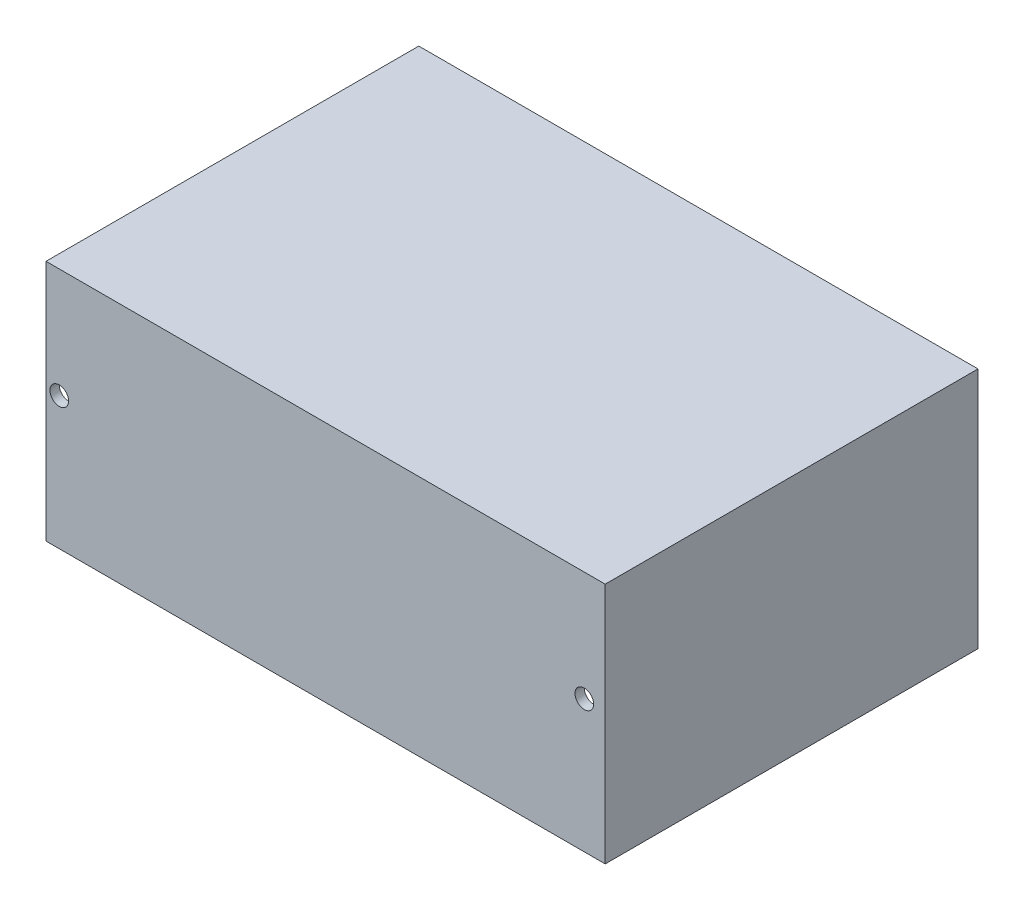
ISO-10303-21;
HEADER;
FILE_DESCRIPTION(('STEP AP214'),'2;1');
FILE_NAME('part.step','',(''),(''),'','','');
FILE_SCHEMA(('AUTOMOTIVE_DESIGN { 1 0 10303 214 1 1 1 1 }'));
ENDSEC;
DATA;
#1=APPLICATION_CONTEXT('core data for automotive mechanical design processes');
#2=APPLICATION_PROTOCOL_DEFINITION('international standard','automotive_design',2000,#1);
#3=PRODUCT_CONTEXT('',#1,'mechanical');
#4=PRODUCT('Part','Part','',(#3));
#5=PRODUCT_RELATED_PRODUCT_CATEGORY('part','',(#4));
#6=PRODUCT_DEFINITION_FORMATION('','',#4);
#7=PRODUCT_DEFINITION_CONTEXT('part definition',#1,'design');
#8=PRODUCT_DEFINITION('design','',#6,#7);
#9=PRODUCT_DEFINITION_SHAPE('','',#8);
#10=(LENGTH_UNIT() NAMED_UNIT(*) SI_UNIT(.MILLI.,.METRE.));
#11=(NAMED_UNIT(*) PLANE_ANGLE_UNIT() SI_UNIT($,.RADIAN.));
#12=(NAMED_UNIT(*) SI_UNIT($,.STERADIAN.) SOLID_ANGLE_UNIT());
#13=UNCERTAINTY_MEASURE_WITH_UNIT(LENGTH_MEASURE(1.E-05),#10,'distance_accuracy_value','');
#14=(GEOMETRIC_REPRESENTATION_CONTEXT(3) GLOBAL_UNCERTAINTY_ASSIGNED_CONTEXT((#13)) GLOBAL_UNIT_ASSIGNED_CONTEXT((#10,
#11,#12)) REPRESENTATION_CONTEXT('',''));
#15=CARTESIAN_POINT('',(0.,0.,0.));
#16=DIRECTION('',(0.,0.,1.));
#17=DIRECTION('',(1.,0.,0.));
#18=AXIS2_PLACEMENT_3D('',#15,#16,#17);
#19=CARTESIAN_POINT('',(300.,123.885017421603,181.15614040887));
#20=DIRECTION('',(0.,0.,-1.));
#21=DIRECTION('',(-1.,0.,0.));
#22=AXIS2_PLACEMENT_3D('',#19,#20,#21);
#23=PLANE('',#22);
#24=CARTESIAN_POINT('',(7.10538066,65.,181.15614040887));
#25=DIRECTION('',(0.,0.,1.));
#26=DIRECTION('',(1.,0.,0.));
#27=AXIS2_PLACEMENT_3D('',#24,#25,#26);
#28=CIRCLE('',#27,5.);
#29=CARTESIAN_POINT('',(12.10538066,65.,181.15614040887));
#30=VERTEX_POINT('',#29);
#31=EDGE_CURVE('E193',#30,#30,#28,.T.);
#32=ORIENTED_EDGE('',*,*,#31,.F.);
#33=EDGE_LOOP('',(#32));
#34=FACE_BOUND('',#33,.T.);
#35=CARTESIAN_POINT('',(288.794979596571,65.,181.15614040887));
#36=DIRECTION('',(0.,0.,-1.));
#37=DIRECTION('',(-1.,0.,0.));
#38=AXIS2_PLACEMENT_3D('',#35,#36,#37);
#39=CIRCLE('',#38,4.99999999999999);
#40=CARTESIAN_POINT('',(283.794979596571,65.,181.15614040887));
#41=VERTEX_POINT('',#40);
#42=EDGE_CURVE('E145',#41,#41,#39,.T.);
#43=ORIENTED_EDGE('',*,*,#42,.T.);
#44=EDGE_LOOP('',(#43));
#45=FACE_BOUND('',#44,.T.);
#46=DIRECTION('',(0.,-1.,0.));
#47=VECTOR('',#46,1.);
#48=CARTESIAN_POINT('',(0.,123.885017421603,181.15614040887));
#49=LINE('',#48,#47);
#50=CARTESIAN_POINT('',(0.,123.885017421603,181.15614040887));
#51=VERTEX_POINT('',#50);
#52=CARTESIAN_POINT('',(0.,-6.11498257839724,181.15614040887));
#53=VERTEX_POINT('',#52);
#54=EDGE_CURVE('E155',#51,#53,#49,.T.);
#55=ORIENTED_EDGE('',*,*,#54,.T.);
#56=DIRECTION('',(-1.,0.,0.));
#57=VECTOR('',#56,1.);
#58=CARTESIAN_POINT('',(300.,-6.11498257839724,181.15614040887));
#59=LINE('',#58,#57);
#60=CARTESIAN_POINT('',(300.,-6.11498257839724,181.15614040887));
#61=VERTEX_POINT('',#60);
#62=EDGE_CURVE('E11',#61,#53,#59,.T.);
#63=ORIENTED_EDGE('',*,*,#62,.F.);
#64=DIRECTION('',(0.,-1.,0.));
#65=VECTOR('',#64,1.);
#66=CARTESIAN_POINT('',(300.,123.885017421603,181.15614040887));
#67=LINE('',#66,#65);
#68=CARTESIAN_POINT('',(300.,123.885017421603,181.15614040887));
#69=VERTEX_POINT('',#68);
#70=EDGE_CURVE('E156',#69,#61,#67,.T.);
#71=ORIENTED_EDGE('',*,*,#70,.F.);
#72=DIRECTION('',(-1.,0.,0.));
#73=VECTOR('',#72,1.);
#74=CARTESIAN_POINT('',(300.,123.885017421603,181.15614040887));
#75=LINE('',#74,#73);
#76=EDGE_CURVE('E162',#69,#51,#75,.T.);
#77=ORIENTED_EDGE('',*,*,#76,.T.);
#78=EDGE_LOOP('',(#55,#63,#71,#77));
#79=FACE_BOUND('',#78,.T.);
#80=ADVANCED_FACE('F41',(#34,#45,#79),#23,.F.);
#81=CARTESIAN_POINT('',(300.,-6.11498257839724,181.15614040887));
#82=DIRECTION('',(0.,1.,0.));
#83=DIRECTION('',(0.,0.,1.));
#84=AXIS2_PLACEMENT_3D('',#81,#82,#83);
#85=PLANE('',#84);
#86=DIRECTION('',(0.,0.,-1.));
#87=VECTOR('',#86,1.);
#88=CARTESIAN_POINT('',(295.,-6.11498257839724,181.15614040887));
#89=LINE('',#88,#87);
#90=CARTESIAN_POINT('',(295.,-6.11498257839724,176.15614040887));
#91=VERTEX_POINT('',#90);
#92=CARTESIAN_POINT('',(295.,-6.11498257839724,-13.8438595911297));
#93=VERTEX_POINT('',#92);
#94=EDGE_CURVE('E136',#91,#93,#89,.T.);
#95=ORIENTED_EDGE('',*,*,#94,.T.);
#96=DIRECTION('',(-1.,0.,0.));
#97=VECTOR('',#96,1.);
#98=CARTESIAN_POINT('',(300.,-6.11498257839724,-13.8438595911297));
#99=LINE('',#98,#97);
#100=CARTESIAN_POINT('',(0.,-6.11498257839724,-13.8438595911297));
#101=VERTEX_POINT('',#100);
#102=EDGE_CURVE('E146',#93,#101,#99,.T.);
#103=ORIENTED_EDGE('',*,*,#102,.T.);
#104=DIRECTION('',(0.,0.,-1.));
#105=VECTOR('',#104,1.);
#106=CARTESIAN_POINT('',(0.,-6.11498257839724,181.15614040887));
#107=LINE('',#106,#105);
#108=CARTESIAN_POINT('',(0.,-6.11498257839724,-18.8438595911297));
#109=VERTEX_POINT('',#108);
#110=EDGE_CURVE('E164',#101,#109,#107,.T.);
#111=ORIENTED_EDGE('',*,*,#110,.T.);
#112=DIRECTION('',(-1.,0.,0.));
#113=VECTOR('',#112,1.);
#114=CARTESIAN_POINT('',(300.,-6.11498257839724,-18.8438595911297));
#115=LINE('',#114,#113);
#116=CARTESIAN_POINT('',(300.,-6.11498257839724,-18.8438595911297));
#117=VERTEX_POINT('',#116);
#118=EDGE_CURVE('E47',#117,#109,#115,.T.);
#119=ORIENTED_EDGE('',*,*,#118,.F.);
#120=DIRECTION('',(0.,0.,-1.));
#121=VECTOR('',#120,1.);
#122=CARTESIAN_POINT('',(300.,-6.11498257839724,181.15614040887));
#123=LINE('',#122,#121);
#124=EDGE_CURVE('E92',#61,#117,#123,.T.);
#125=ORIENTED_EDGE('',*,*,#124,.F.);
#126=ORIENTED_EDGE('',*,*,#62,.T.);
#127=CARTESIAN_POINT('',(0.,-6.11498257839724,176.15614040887));
#128=VERTEX_POINT('',#127);
#129=EDGE_CURVE('E168',#53,#128,#107,.T.);
#130=ORIENTED_EDGE('',*,*,#129,.T.);
#131=DIRECTION('',(-1.,0.,0.));
#132=VECTOR('',#131,1.);
#133=CARTESIAN_POINT('',(300.,-6.11498257839724,176.15614040887));
#134=LINE('',#133,#132);
#135=EDGE_CURVE('E152',#91,#128,#134,.T.);
#136=ORIENTED_EDGE('',*,*,#135,.F.);
#137=EDGE_LOOP('',(#95,#103,#111,#119,#125,#126,#130,#136));
#138=FACE_BOUND('',#137,.T.);
#139=ADVANCED_FACE('F211',(#138),#85,.F.);
#140=CARTESIAN_POINT('',(300.,123.885017421603,-18.8438595911297));
#141=DIRECTION('',(0.,0.,1.));
#142=DIRECTION('',(0.,-1.,0.));
#143=AXIS2_PLACEMENT_3D('',#140,#141,#142);
#144=PLANE('',#143);
#145=CARTESIAN_POINT('',(7.10538066,65.,-18.8438595911297));
#146=DIRECTION('',(0.,0.,1.));
#147=DIRECTION('',(0.,-1.,0.));
#148=AXIS2_PLACEMENT_3D('',#145,#146,#147);
#149=CIRCLE('',#148,5.);
#150=CARTESIAN_POINT('',(7.10538066,60.,-18.8438595911297));
#151=VERTEX_POINT('',#150);
#152=EDGE_CURVE('E183',#151,#151,#149,.T.);
#153=ORIENTED_EDGE('',*,*,#152,.T.);
#154=EDGE_LOOP('',(#153));
#155=FACE_BOUND('',#154,.T.);
#156=CARTESIAN_POINT('',(288.794979596571,65.,-18.8438595911297));
#157=DIRECTION('',(0.,0.,-1.));
#158=DIRECTION('',(-1.,0.,0.));
#159=AXIS2_PLACEMENT_3D('',#156,#157,#158);
#160=CIRCLE('',#159,4.99999999999999);
#161=CARTESIAN_POINT('',(283.794979596571,65.,-18.8438595911297));
#162=VERTEX_POINT('',#161);
#163=EDGE_CURVE('E177',#162,#162,#160,.T.);
#164=ORIENTED_EDGE('',*,*,#163,.F.);
#165=EDGE_LOOP('',(#164));
#166=FACE_BOUND('',#165,.T.);
#167=DIRECTION('',(0.,1.,0.));
#168=VECTOR('',#167,1.);
#169=CARTESIAN_POINT('',(0.,123.885017421603,-18.8438595911297));
#170=LINE('',#169,#168);
#171=CARTESIAN_POINT('',(0.,123.885017421603,-18.8438595911297));
#172=VERTEX_POINT('',#171);
#173=EDGE_CURVE('E169',#109,#172,#170,.T.);
#174=ORIENTED_EDGE('',*,*,#173,.T.);
#175=DIRECTION('',(-1.,0.,0.));
#176=VECTOR('',#175,1.);
#177=CARTESIAN_POINT('',(300.,123.885017421603,-18.8438595911297));
#178=LINE('',#177,#176);
#179=CARTESIAN_POINT('',(300.,123.885017421603,-18.8438595911297));
#180=VERTEX_POINT('',#179);
#181=EDGE_CURVE('E173',#180,#172,#178,.T.);
#182=ORIENTED_EDGE('',*,*,#181,.F.);
#183=DIRECTION('',(0.,1.,0.));
#184=VECTOR('',#183,1.);
#185=CARTESIAN_POINT('',(300.,123.885017421603,-18.8438595911297));
#186=LINE('',#185,#184);
#187=EDGE_CURVE('E157',#117,#180,#186,.T.);
#188=ORIENTED_EDGE('',*,*,#187,.F.);
#189=ORIENTED_EDGE('',*,*,#118,.T.);
#190=EDGE_LOOP('',(#174,#182,#188,#189));
#191=FACE_BOUND('',#190,.T.);
#192=ADVANCED_FACE('F217',(#155,#166,#191),#144,.F.);
#193=CARTESIAN_POINT('',(300.,123.885017421603,181.15614040887));
#194=DIRECTION('',(0.,-1.,0.));
#195=DIRECTION('',(0.,0.,-1.));
#196=AXIS2_PLACEMENT_3D('',#193,#194,#195);
#197=PLANE('',#196);
#198=DIRECTION('',(0.,0.,1.));
#199=VECTOR('',#198,1.);
#200=CARTESIAN_POINT('',(0.,123.885017421603,181.15614040887));
#201=LINE('',#200,#199);
#202=EDGE_CURVE('E87',#172,#51,#201,.T.);
#203=ORIENTED_EDGE('',*,*,#202,.T.);
#204=ORIENTED_EDGE('',*,*,#76,.F.);
#205=DIRECTION('',(0.,0.,1.));
#206=VECTOR('',#205,1.);
#207=CARTESIAN_POINT('',(300.,123.885017421603,181.15614040887));
#208=LINE('',#207,#206);
#209=EDGE_CURVE('E66',#180,#69,#208,.T.);
#210=ORIENTED_EDGE('',*,*,#209,.F.);
#211=ORIENTED_EDGE('',*,*,#181,.T.);
#212=EDGE_LOOP('',(#203,#204,#210,#211));
#213=FACE_BOUND('',#212,.T.);
#214=ADVANCED_FACE('F218',(#213),#197,.F.);
#215=CARTESIAN_POINT('',(300.,0.,0.));
#216=DIRECTION('',(1.,0.,0.));
#217=DIRECTION('',(0.,0.,-1.));
#218=AXIS2_PLACEMENT_3D('',#215,#216,#217);
#219=PLANE('',#218);
#220=ORIENTED_EDGE('',*,*,#70,.T.);
#221=ORIENTED_EDGE('',*,*,#124,.T.);
#222=ORIENTED_EDGE('',*,*,#187,.T.);
#223=ORIENTED_EDGE('',*,*,#209,.T.);
#224=EDGE_LOOP('',(#220,#221,#222,#223));
#225=FACE_BOUND('',#224,.T.);
#226=ADVANCED_FACE('F223',(#225),#219,.T.);
#227=CARTESIAN_POINT('',(0.,0.,0.));
#228=DIRECTION('',(1.,0.,0.));
#229=DIRECTION('',(0.,0.,-1.));
#230=AXIS2_PLACEMENT_3D('',#227,#228,#229);
#231=PLANE('',#230);
#232=DIRECTION('',(0.,0.,1.));
#233=VECTOR('',#232,1.);
#234=CARTESIAN_POINT('',(0.,118.885017421603,181.15614040887));
#235=LINE('',#234,#233);
#236=CARTESIAN_POINT('',(0.,118.885017421603,-13.8438595911297));
#237=VERTEX_POINT('',#236);
#238=CARTESIAN_POINT('',(0.,118.885017421603,176.15614040887));
#239=VERTEX_POINT('',#238);
#240=EDGE_CURVE('E60',#237,#239,#235,.T.);
#241=ORIENTED_EDGE('',*,*,#240,.T.);
#242=DIRECTION('',(0.,-1.,0.));
#243=VECTOR('',#242,1.);
#244=CARTESIAN_POINT('',(0.,123.885017421603,176.15614040887));
#245=LINE('',#244,#243);
#246=EDGE_CURVE('E132',#239,#128,#245,.T.);
#247=ORIENTED_EDGE('',*,*,#246,.T.);
#248=ORIENTED_EDGE('',*,*,#129,.F.);
#249=ORIENTED_EDGE('',*,*,#54,.F.);
#250=ORIENTED_EDGE('',*,*,#202,.F.);
#251=ORIENTED_EDGE('',*,*,#173,.F.);
#252=ORIENTED_EDGE('',*,*,#110,.F.);
#253=DIRECTION('',(0.,1.,0.));
#254=VECTOR('',#253,1.);
#255=CARTESIAN_POINT('',(0.,123.885017421603,-13.8438595911297));
#256=LINE('',#255,#254);
#257=EDGE_CURVE('E137',#101,#237,#256,.T.);
#258=ORIENTED_EDGE('',*,*,#257,.T.);
#259=EDGE_LOOP('',(#241,#247,#248,#249,#250,#251,#252,#258));
#260=FACE_BOUND('',#259,.T.);
#261=ADVANCED_FACE('F212',(#260),#231,.F.);
#262=CARTESIAN_POINT('',(300.,123.885017421603,176.15614040887));
#263=DIRECTION('',(0.,0.,-1.));
#264=DIRECTION('',(-1.,0.,0.));
#265=AXIS2_PLACEMENT_3D('',#262,#263,#264);
#266=PLANE('',#265);
#267=CARTESIAN_POINT('',(7.10538066,65.,176.15614040887));
#268=DIRECTION('',(0.,0.,-1.));
#269=DIRECTION('',(-1.,0.,0.));
#270=AXIS2_PLACEMENT_3D('',#267,#268,#269);
#271=CIRCLE('',#270,5.);
#272=CARTESIAN_POINT('',(2.10538066,65.,176.15614040887));
#273=VERTEX_POINT('',#272);
#274=EDGE_CURVE('E186',#273,#273,#271,.T.);
#275=ORIENTED_EDGE('',*,*,#274,.F.);
#276=EDGE_LOOP('',(#275));
#277=FACE_BOUND('',#276,.T.);
#278=CARTESIAN_POINT('',(288.794979596571,65.,176.15614040887));
#279=DIRECTION('',(0.,0.,-1.));
#280=DIRECTION('',(-1.,0.,0.));
#281=AXIS2_PLACEMENT_3D('',#278,#279,#280);
#282=CIRCLE('',#281,4.99999999999999);
#283=CARTESIAN_POINT('',(283.794979596571,65.,176.15614040887));
#284=VERTEX_POINT('',#283);
#285=EDGE_CURVE('E178',#284,#284,#282,.T.);
#286=ORIENTED_EDGE('',*,*,#285,.F.);
#287=EDGE_LOOP('',(#286));
#288=FACE_BOUND('',#287,.T.);
#289=ORIENTED_EDGE('',*,*,#246,.F.);
#290=DIRECTION('',(-1.,0.,0.));
#291=VECTOR('',#290,1.);
#292=CARTESIAN_POINT('',(300.,118.885017421603,176.15614040887));
#293=LINE('',#292,#291);
#294=CARTESIAN_POINT('',(295.,118.885017421603,176.15614040887));
#295=VERTEX_POINT('',#294);
#296=EDGE_CURVE('E117',#295,#239,#293,.T.);
#297=ORIENTED_EDGE('',*,*,#296,.F.);
#298=DIRECTION('',(0.,-1.,0.));
#299=VECTOR('',#298,1.);
#300=CARTESIAN_POINT('',(295.,123.885017421603,176.15614040887));
#301=LINE('',#300,#299);
#302=EDGE_CURVE('E128',#295,#91,#301,.T.);
#303=ORIENTED_EDGE('',*,*,#302,.T.);
#304=ORIENTED_EDGE('',*,*,#135,.T.);
#305=EDGE_LOOP('',(#289,#297,#303,#304));
#306=FACE_BOUND('',#305,.T.);
#307=ADVANCED_FACE('F127',(#277,#288,#306),#266,.T.);
#308=CARTESIAN_POINT('',(300.,123.885017421603,-13.8438595911297));
#309=DIRECTION('',(0.,0.,1.));
#310=DIRECTION('',(0.,-1.,0.));
#311=AXIS2_PLACEMENT_3D('',#308,#309,#310);
#312=PLANE('',#311);
#313=CARTESIAN_POINT('',(7.10538066,65.,-13.8438595911297));
#314=DIRECTION('',(0.,0.,1.));
#315=DIRECTION('',(0.,-1.,0.));
#316=AXIS2_PLACEMENT_3D('',#313,#314,#315);
#317=CIRCLE('',#316,5.);
#318=CARTESIAN_POINT('',(7.10538066,60.,-13.8438595911297));
#319=VERTEX_POINT('',#318);
#320=EDGE_CURVE('E42',#319,#319,#317,.T.);
#321=ORIENTED_EDGE('',*,*,#320,.F.);
#322=EDGE_LOOP('',(#321));
#323=FACE_BOUND('',#322,.T.);
#324=CARTESIAN_POINT('',(288.794979596571,65.,-13.8438595911297));
#325=DIRECTION('',(0.,0.,1.));
#326=DIRECTION('',(0.,-1.,0.));
#327=AXIS2_PLACEMENT_3D('',#324,#325,#326);
#328=CIRCLE('',#327,4.99999999999999);
#329=CARTESIAN_POINT('',(288.794979596571,60.,-13.8438595911297));
#330=VERTEX_POINT('',#329);
#331=EDGE_CURVE('E176',#330,#330,#328,.T.);
#332=ORIENTED_EDGE('',*,*,#331,.F.);
#333=EDGE_LOOP('',(#332));
#334=FACE_BOUND('',#333,.T.);
#335=ORIENTED_EDGE('',*,*,#257,.F.);
#336=ORIENTED_EDGE('',*,*,#102,.F.);
#337=DIRECTION('',(0.,1.,0.));
#338=VECTOR('',#337,1.);
#339=CARTESIAN_POINT('',(295.,123.885017421603,-13.8438595911297));
#340=LINE('',#339,#338);
#341=CARTESIAN_POINT('',(295.,118.885017421603,-13.8438595911297));
#342=VERTEX_POINT('',#341);
#343=EDGE_CURVE('E121',#93,#342,#340,.T.);
#344=ORIENTED_EDGE('',*,*,#343,.T.);
#345=DIRECTION('',(-1.,0.,0.));
#346=VECTOR('',#345,1.);
#347=CARTESIAN_POINT('',(300.,118.885017421603,-13.8438595911297));
#348=LINE('',#347,#346);
#349=EDGE_CURVE('E119',#342,#237,#348,.T.);
#350=ORIENTED_EDGE('',*,*,#349,.T.);
#351=EDGE_LOOP('',(#335,#336,#344,#350));
#352=FACE_BOUND('',#351,.T.);
#353=ADVANCED_FACE('F202',(#323,#334,#352),#312,.T.);
#354=CARTESIAN_POINT('',(300.,118.885017421603,181.15614040887));
#355=DIRECTION('',(0.,-1.,0.));
#356=DIRECTION('',(0.,0.,-1.));
#357=AXIS2_PLACEMENT_3D('',#354,#355,#356);
#358=PLANE('',#357);
#359=ORIENTED_EDGE('',*,*,#240,.F.);
#360=ORIENTED_EDGE('',*,*,#349,.F.);
#361=DIRECTION('',(0.,0.,1.));
#362=VECTOR('',#361,1.);
#363=CARTESIAN_POINT('',(295.,118.885017421603,181.15614040887));
#364=LINE('',#363,#362);
#365=EDGE_CURVE('E114',#342,#295,#364,.T.);
#366=ORIENTED_EDGE('',*,*,#365,.T.);
#367=ORIENTED_EDGE('',*,*,#296,.T.);
#368=EDGE_LOOP('',(#359,#360,#366,#367));
#369=FACE_BOUND('',#368,.T.);
#370=ADVANCED_FACE('F120',(#369),#358,.T.);
#371=CARTESIAN_POINT('',(295.,0.,0.));
#372=DIRECTION('',(1.,0.,0.));
#373=DIRECTION('',(0.,0.,-1.));
#374=AXIS2_PLACEMENT_3D('',#371,#372,#373);
#375=PLANE('',#374);
#376=ORIENTED_EDGE('',*,*,#302,.F.);
#377=ORIENTED_EDGE('',*,*,#365,.F.);
#378=ORIENTED_EDGE('',*,*,#343,.F.);
#379=ORIENTED_EDGE('',*,*,#94,.F.);
#380=EDGE_LOOP('',(#376,#377,#378,#379));
#381=FACE_BOUND('',#380,.T.);
#382=ADVANCED_FACE('F133',(#381),#375,.F.);
#383=CARTESIAN_POINT('',(288.794979596571,65.,281.15614040887));
#384=DIRECTION('',(0.,0.,-1.));
#385=DIRECTION('',(-1.,0.,0.));
#386=AXIS2_PLACEMENT_3D('',#383,#384,#385);
#387=CYLINDRICAL_SURFACE('',#386,4.99999999999999);
#388=ORIENTED_EDGE('',*,*,#331,.T.);
#389=EDGE_LOOP('',(#388));
#390=FACE_BOUND('',#389,.T.);
#391=ORIENTED_EDGE('',*,*,#163,.T.);
#392=EDGE_LOOP('',(#391));
#393=FACE_BOUND('',#392,.T.);
#394=ADVANCED_FACE('F246',(#390,#393),#387,.F.);
#395=ORIENTED_EDGE('',*,*,#285,.T.);
#396=EDGE_LOOP('',(#395));
#397=FACE_BOUND('',#396,.T.);
#398=ORIENTED_EDGE('',*,*,#42,.F.);
#399=EDGE_LOOP('',(#398));
#400=FACE_BOUND('',#399,.T.);
#401=ADVANCED_FACE('F244',(#397,#400),#387,.F.);
#402=CARTESIAN_POINT('',(7.10538066,65.,-118.84385959113));
#403=DIRECTION('',(0.,0.,1.));
#404=DIRECTION('',(1.,0.,0.));
#405=AXIS2_PLACEMENT_3D('',#402,#403,#404);
#406=CYLINDRICAL_SURFACE('',#405,5.);
#407=ORIENTED_EDGE('',*,*,#320,.T.);
#408=EDGE_LOOP('',(#407));
#409=FACE_BOUND('',#408,.T.);
#410=ORIENTED_EDGE('',*,*,#152,.F.);
#411=EDGE_LOOP('',(#410));
#412=FACE_BOUND('',#411,.T.);
#413=ADVANCED_FACE('F201',(#409,#412),#406,.F.);
#414=ORIENTED_EDGE('',*,*,#274,.T.);
#415=EDGE_LOOP('',(#414));
#416=FACE_BOUND('',#415,.T.);
#417=ORIENTED_EDGE('',*,*,#31,.T.);
#418=EDGE_LOOP('',(#417));
#419=FACE_BOUND('',#418,.T.);
#420=ADVANCED_FACE('F254',(#416,#419),#406,.F.);
#421=CLOSED_SHELL('',(#80,#139,#192,#214,#226,#261,#307,#353,#370,#382,#394,#401,#413,#420));
#422=MANIFOLD_SOLID_BREP('B2',#421);
#423=ADVANCED_BREP_SHAPE_REPRESENTATION('',(#18,#422),#14);
#424=SHAPE_DEFINITION_REPRESENTATION(#9,#423);
ENDSEC;
END-ISO-10303-21;
